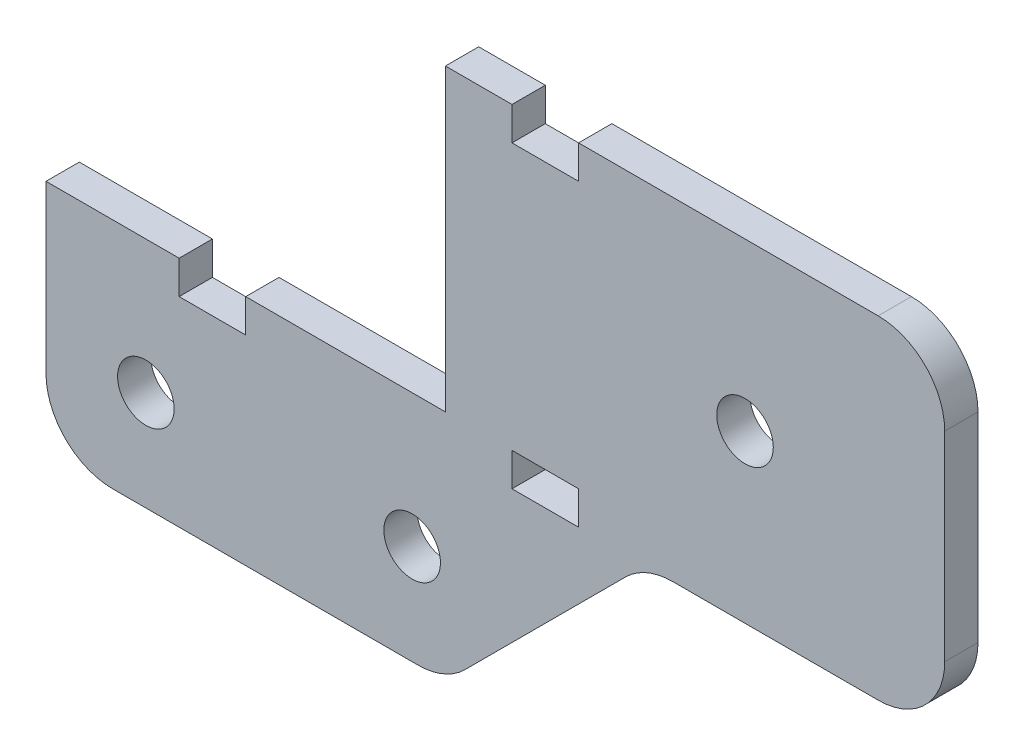
ISO-10303-21;
HEADER;
FILE_DESCRIPTION(('STEP AP214'),'2;1');
FILE_NAME('part.step','',(''),(''),'','','');
FILE_SCHEMA(('AUTOMOTIVE_DESIGN { 1 0 10303 214 1 1 1 1 }'));
ENDSEC;
DATA;
#1=APPLICATION_CONTEXT('core data for automotive mechanical design processes');
#2=APPLICATION_PROTOCOL_DEFINITION('international standard','automotive_design',2000,#1);
#3=PRODUCT_CONTEXT('',#1,'mechanical');
#4=PRODUCT('Part','Part','',(#3));
#5=PRODUCT_RELATED_PRODUCT_CATEGORY('part','',(#4));
#6=PRODUCT_DEFINITION_FORMATION('','',#4);
#7=PRODUCT_DEFINITION_CONTEXT('part definition',#1,'design');
#8=PRODUCT_DEFINITION('design','',#6,#7);
#9=PRODUCT_DEFINITION_SHAPE('','',#8);
#10=(LENGTH_UNIT() NAMED_UNIT(*) SI_UNIT(.MILLI.,.METRE.));
#11=(NAMED_UNIT(*) PLANE_ANGLE_UNIT() SI_UNIT($,.RADIAN.));
#12=(NAMED_UNIT(*) SI_UNIT($,.STERADIAN.) SOLID_ANGLE_UNIT());
#13=UNCERTAINTY_MEASURE_WITH_UNIT(LENGTH_MEASURE(1.E-05),#10,'distance_accuracy_value','');
#14=(GEOMETRIC_REPRESENTATION_CONTEXT(3) GLOBAL_UNCERTAINTY_ASSIGNED_CONTEXT((#13)) GLOBAL_UNIT_ASSIGNED_CONTEXT((#10,
#11,#12)) REPRESENTATION_CONTEXT('',''));
#15=CARTESIAN_POINT('',(0.,0.,0.));
#16=DIRECTION('',(0.,0.,1.));
#17=DIRECTION('',(1.,0.,0.));
#18=AXIS2_PLACEMENT_3D('',#15,#16,#17);
#19=CARTESIAN_POINT('',(-30.,0.,2.5));
#20=DIRECTION('',(1.,0.,0.));
#21=DIRECTION('',(0.,0.,-1.));
#22=AXIS2_PLACEMENT_3D('',#19,#20,#21);
#23=PLANE('',#22);
#24=DIRECTION('',(0.,-1.,0.));
#25=VECTOR('',#24,1.);
#26=CARTESIAN_POINT('',(-30.,0.,-2.5));
#27=LINE('',#26,#25);
#28=CARTESIAN_POINT('',(-30.,-20.,-2.5));
#29=VERTEX_POINT('',#28);
#30=CARTESIAN_POINT('',(-30.,-25.,-2.5));
#31=VERTEX_POINT('',#30);
#32=EDGE_CURVE('E369',#29,#31,#27,.T.);
#33=ORIENTED_EDGE('',*,*,#32,.T.);
#34=DIRECTION('',(0.,0.,-1.));
#35=VECTOR('',#34,1.);
#36=CARTESIAN_POINT('',(-30.,-25.,2.5));
#37=LINE('',#36,#35);
#38=CARTESIAN_POINT('',(-30.,-25.,2.5));
#39=VERTEX_POINT('',#38);
#40=EDGE_CURVE('E387',#39,#31,#37,.T.);
#41=ORIENTED_EDGE('',*,*,#40,.F.);
#42=DIRECTION('',(0.,-1.,0.));
#43=VECTOR('',#42,1.);
#44=CARTESIAN_POINT('',(-30.,0.,2.5));
#45=LINE('',#44,#43);
#46=CARTESIAN_POINT('',(-30.,-20.,2.5));
#47=VERTEX_POINT('',#46);
#48=EDGE_CURVE('E313',#47,#39,#45,.T.);
#49=ORIENTED_EDGE('',*,*,#48,.F.);
#50=DIRECTION('',(0.,0.,-1.));
#51=VECTOR('',#50,1.);
#52=CARTESIAN_POINT('',(-30.,-20.,2.5));
#53=LINE('',#52,#51);
#54=EDGE_CURVE('E224',#47,#29,#53,.T.);
#55=ORIENTED_EDGE('',*,*,#54,.T.);
#56=EDGE_LOOP('',(#33,#41,#49,#55));
#57=FACE_BOUND('',#56,.T.);
#58=ADVANCED_FACE('F44',(#57),#23,.F.);
#59=CARTESIAN_POINT('',(0.,-25.,2.5));
#60=DIRECTION('',(0.,1.,0.));
#61=DIRECTION('',(0.,0.,1.));
#62=AXIS2_PLACEMENT_3D('',#59,#60,#61);
#63=PLANE('',#62);
#64=DIRECTION('',(1.,0.,0.));
#65=VECTOR('',#64,1.);
#66=CARTESIAN_POINT('',(0.,-25.,-2.5));
#67=LINE('',#66,#65);
#68=CARTESIAN_POINT('',(-40.,-25.,-2.5));
#69=VERTEX_POINT('',#68);
#70=EDGE_CURVE('E372',#69,#31,#67,.T.);
#71=ORIENTED_EDGE('',*,*,#70,.F.);
#72=DIRECTION('',(0.,0.,-1.));
#73=VECTOR('',#72,1.);
#74=CARTESIAN_POINT('',(-40.,-25.,2.5));
#75=LINE('',#74,#73);
#76=CARTESIAN_POINT('',(-40.,-25.,2.5));
#77=VERTEX_POINT('',#76);
#78=EDGE_CURVE('E385',#77,#69,#75,.T.);
#79=ORIENTED_EDGE('',*,*,#78,.F.);
#80=DIRECTION('',(1.,0.,0.));
#81=VECTOR('',#80,1.);
#82=CARTESIAN_POINT('',(0.,-25.,2.5));
#83=LINE('',#82,#81);
#84=EDGE_CURVE('E315',#77,#39,#83,.T.);
#85=ORIENTED_EDGE('',*,*,#84,.T.);
#86=ORIENTED_EDGE('',*,*,#40,.T.);
#87=EDGE_LOOP('',(#71,#79,#85,#86));
#88=FACE_BOUND('',#87,.T.);
#89=ADVANCED_FACE('F523',(#88),#63,.T.);
#90=CARTESIAN_POINT('',(-40.,0.,2.5));
#91=DIRECTION('',(-1.,0.,0.));
#92=DIRECTION('',(0.,-1.,0.));
#93=AXIS2_PLACEMENT_3D('',#90,#91,#92);
#94=PLANE('',#93);
#95=DIRECTION('',(0.,1.,0.));
#96=VECTOR('',#95,1.);
#97=CARTESIAN_POINT('',(-40.,0.,-2.5));
#98=LINE('',#97,#96);
#99=CARTESIAN_POINT('',(-40.,-20.,-2.5));
#100=VERTEX_POINT('',#99);
#101=EDGE_CURVE('E375',#69,#100,#98,.T.);
#102=ORIENTED_EDGE('',*,*,#101,.T.);
#103=DIRECTION('',(0.,0.,-1.));
#104=VECTOR('',#103,1.);
#105=CARTESIAN_POINT('',(-40.,-20.,2.5));
#106=LINE('',#105,#104);
#107=CARTESIAN_POINT('',(-40.,-20.,2.5));
#108=VERTEX_POINT('',#107);
#109=EDGE_CURVE('E382',#108,#100,#106,.T.);
#110=ORIENTED_EDGE('',*,*,#109,.F.);
#111=DIRECTION('',(0.,1.,0.));
#112=VECTOR('',#111,1.);
#113=CARTESIAN_POINT('',(-40.,0.,2.5));
#114=LINE('',#113,#112);
#115=EDGE_CURVE('E321',#77,#108,#114,.T.);
#116=ORIENTED_EDGE('',*,*,#115,.F.);
#117=ORIENTED_EDGE('',*,*,#78,.T.);
#118=EDGE_LOOP('',(#102,#110,#116,#117));
#119=FACE_BOUND('',#118,.T.);
#120=ADVANCED_FACE('F529',(#119),#94,.F.);
#121=CARTESIAN_POINT('',(2.50000000000001,-2.50000000000001,2.5));
#122=DIRECTION('',(-0.707106781186547,0.707106781186548,0.));
#123=DIRECTION('',(-0.707106781186548,-0.707106781186547,0.));
#124=AXIS2_PLACEMENT_3D('',#121,#122,#123);
#125=PLANE('',#124);
#126=DIRECTION('',(0.707106781186548,0.707106781186547,0.));
#127=VECTOR('',#126,1.);
#128=CARTESIAN_POINT('',(2.50000000000001,-2.50000000000001,2.5));
#129=LINE('',#128,#127);
#130=CARTESIAN_POINT('',(-47.0710678118655,-52.0710678118655,2.5));
#131=VERTEX_POINT('',#130);
#132=CARTESIAN_POINT('',(-22.9289321881345,-27.9289321881345,2.5));
#133=VERTEX_POINT('',#132);
#134=EDGE_CURVE('E379',#131,#133,#129,.T.);
#135=ORIENTED_EDGE('',*,*,#134,.F.);
#136=DIRECTION('',(0.,0.,-1.));
#137=VECTOR('',#136,1.);
#138=CARTESIAN_POINT('',(-47.0710678118655,-52.0710678118655,2.5));
#139=LINE('',#138,#137);
#140=CARTESIAN_POINT('',(-47.0710678118655,-52.0710678118655,-2.5));
#141=VERTEX_POINT('',#140);
#142=EDGE_CURVE('E434',#131,#141,#139,.T.);
#143=ORIENTED_EDGE('',*,*,#142,.T.);
#144=DIRECTION('',(0.707106781186548,0.707106781186547,0.));
#145=VECTOR('',#144,1.);
#146=CARTESIAN_POINT('',(2.50000000000001,-2.50000000000001,-2.5));
#147=LINE('',#146,#145);
#148=CARTESIAN_POINT('',(-22.9289321881345,-27.9289321881345,-2.5));
#149=VERTEX_POINT('',#148);
#150=EDGE_CURVE('E327',#141,#149,#147,.T.);
#151=ORIENTED_EDGE('',*,*,#150,.T.);
#152=DIRECTION('',(0.,0.,-1.));
#153=VECTOR('',#152,1.);
#154=CARTESIAN_POINT('',(-22.9289321881345,-27.9289321881345,2.5));
#155=LINE('',#154,#153);
#156=EDGE_CURVE('E437',#149,#133,#155,.F.);
#157=ORIENTED_EDGE('',*,*,#156,.T.);
#158=EDGE_LOOP('',(#135,#143,#151,#157));
#159=FACE_BOUND('',#158,.T.);
#160=ADVANCED_FACE('F433',(#159),#125,.F.);
#161=CARTESIAN_POINT('',(0.,-25.,2.5));
#162=DIRECTION('',(0.,1.,0.));
#163=DIRECTION('',(-1.,0.,0.));
#164=AXIS2_PLACEMENT_3D('',#161,#162,#163);
#165=PLANE('',#164);
#166=DIRECTION('',(1.,0.,0.));
#167=VECTOR('',#166,1.);
#168=CARTESIAN_POINT('',(0.,-25.,-2.5));
#169=LINE('',#168,#167);
#170=CARTESIAN_POINT('',(-15.857864376269,-25.,-2.5));
#171=VERTEX_POINT('',#170);
#172=CARTESIAN_POINT('',(15.,-25.,-2.5));
#173=VERTEX_POINT('',#172);
#174=EDGE_CURVE('E330',#171,#173,#169,.T.);
#175=ORIENTED_EDGE('',*,*,#174,.T.);
#176=DIRECTION('',(0.,0.,-1.));
#177=VECTOR('',#176,1.);
#178=CARTESIAN_POINT('',(15.,-25.,2.5));
#179=LINE('',#178,#177);
#180=CARTESIAN_POINT('',(15.,-25.,2.5));
#181=VERTEX_POINT('',#180);
#182=EDGE_CURVE('E450',#173,#181,#179,.F.);
#183=ORIENTED_EDGE('',*,*,#182,.T.);
#184=DIRECTION('',(1.,0.,0.));
#185=VECTOR('',#184,1.);
#186=CARTESIAN_POINT('',(0.,-25.,2.5));
#187=LINE('',#186,#185);
#188=CARTESIAN_POINT('',(-15.857864376269,-25.,2.5));
#189=VERTEX_POINT('',#188);
#190=EDGE_CURVE('E438',#189,#181,#187,.T.);
#191=ORIENTED_EDGE('',*,*,#190,.F.);
#192=DIRECTION('',(0.,0.,-1.));
#193=VECTOR('',#192,1.);
#194=CARTESIAN_POINT('',(-15.857864376269,-25.,-2.5));
#195=LINE('',#194,#193);
#196=EDGE_CURVE('E451',#189,#171,#195,.T.);
#197=ORIENTED_EDGE('',*,*,#196,.T.);
#198=EDGE_LOOP('',(#175,#183,#191,#197));
#199=FACE_BOUND('',#198,.T.);
#200=ADVANCED_FACE('F457',(#199),#165,.F.);
#201=CARTESIAN_POINT('',(25.,0.,2.5));
#202=DIRECTION('',(1.,0.,0.));
#203=DIRECTION('',(0.,0.,-1.));
#204=AXIS2_PLACEMENT_3D('',#201,#202,#203);
#205=PLANE('',#204);
#206=DIRECTION('',(0.,-1.,0.));
#207=VECTOR('',#206,1.);
#208=CARTESIAN_POINT('',(25.,0.,-2.5));
#209=LINE('',#208,#207);
#210=CARTESIAN_POINT('',(25.,15.,-2.5));
#211=VERTEX_POINT('',#210);
#212=CARTESIAN_POINT('',(25.,-15.,-2.5));
#213=VERTEX_POINT('',#212);
#214=EDGE_CURVE('E334',#211,#213,#209,.T.);
#215=ORIENTED_EDGE('',*,*,#214,.F.);
#216=DIRECTION('',(0.,0.,-1.));
#217=VECTOR('',#216,1.);
#218=CARTESIAN_POINT('',(25.,15.,2.5));
#219=LINE('',#218,#217);
#220=CARTESIAN_POINT('',(25.,15.,2.5));
#221=VERTEX_POINT('',#220);
#222=EDGE_CURVE('E420',#211,#221,#219,.F.);
#223=ORIENTED_EDGE('',*,*,#222,.T.);
#224=DIRECTION('',(0.,-1.,0.));
#225=VECTOR('',#224,1.);
#226=CARTESIAN_POINT('',(25.,0.,2.5));
#227=LINE('',#226,#225);
#228=CARTESIAN_POINT('',(25.,-15.,2.5));
#229=VERTEX_POINT('',#228);
#230=EDGE_CURVE('E236',#221,#229,#227,.T.);
#231=ORIENTED_EDGE('',*,*,#230,.T.);
#232=DIRECTION('',(0.,0.,-1.));
#233=VECTOR('',#232,1.);
#234=CARTESIAN_POINT('',(25.,-15.,-2.5));
#235=LINE('',#234,#233);
#236=EDGE_CURVE('E418',#229,#213,#235,.T.);
#237=ORIENTED_EDGE('',*,*,#236,.T.);
#238=EDGE_LOOP('',(#215,#223,#231,#237));
#239=FACE_BOUND('',#238,.T.);
#240=ADVANCED_FACE('F468',(#239),#205,.T.);
#241=CARTESIAN_POINT('',(0.,25.,2.5));
#242=DIRECTION('',(0.,1.,0.));
#243=DIRECTION('',(-1.,0.,0.));
#244=AXIS2_PLACEMENT_3D('',#241,#242,#243);
#245=PLANE('',#244);
#246=DIRECTION('',(1.,0.,0.));
#247=VECTOR('',#246,1.);
#248=CARTESIAN_POINT('',(0.,25.,2.5));
#249=LINE('',#248,#247);
#250=CARTESIAN_POINT('',(-30.,25.,2.5));
#251=VERTEX_POINT('',#250);
#252=CARTESIAN_POINT('',(15.,25.,2.5));
#253=VERTEX_POINT('',#252);
#254=EDGE_CURVE('E216',#251,#253,#249,.T.);
#255=ORIENTED_EDGE('',*,*,#254,.T.);
#256=DIRECTION('',(0.,0.,-1.));
#257=VECTOR('',#256,1.);
#258=CARTESIAN_POINT('',(15.,25.,2.5));
#259=LINE('',#258,#257);
#260=CARTESIAN_POINT('',(15.,25.,-2.5));
#261=VERTEX_POINT('',#260);
#262=EDGE_CURVE('E389',#253,#261,#259,.T.);
#263=ORIENTED_EDGE('',*,*,#262,.T.);
#264=DIRECTION('',(1.,0.,0.));
#265=VECTOR('',#264,1.);
#266=CARTESIAN_POINT('',(0.,25.,-2.5));
#267=LINE('',#266,#265);
#268=CARTESIAN_POINT('',(-30.,25.,-2.5));
#269=VERTEX_POINT('',#268);
#270=EDGE_CURVE('E219',#269,#261,#267,.T.);
#271=ORIENTED_EDGE('',*,*,#270,.F.);
#272=DIRECTION('',(0.,0.,-1.));
#273=VECTOR('',#272,1.);
#274=CARTESIAN_POINT('',(-30.,25.,2.5));
#275=LINE('',#274,#273);
#276=EDGE_CURVE('E212',#251,#269,#275,.T.);
#277=ORIENTED_EDGE('',*,*,#276,.F.);
#278=EDGE_LOOP('',(#255,#263,#271,#277));
#279=FACE_BOUND('',#278,.T.);
#280=ADVANCED_FACE('F214',(#279),#245,.T.);
#281=CARTESIAN_POINT('',(-30.,0.,2.5));
#282=DIRECTION('',(-1.,0.,0.));
#283=DIRECTION('',(0.,0.,1.));
#284=AXIS2_PLACEMENT_3D('',#281,#282,#283);
#285=PLANE('',#284);
#286=DIRECTION('',(0.,1.,0.));
#287=VECTOR('',#286,1.);
#288=CARTESIAN_POINT('',(-30.,0.,-2.5));
#289=LINE('',#288,#287);
#290=CARTESIAN_POINT('',(-30.,20.,-2.5));
#291=VERTEX_POINT('',#290);
#292=EDGE_CURVE('E338',#291,#269,#289,.T.);
#293=ORIENTED_EDGE('',*,*,#292,.F.);
#294=DIRECTION('',(0.,0.,-1.));
#295=VECTOR('',#294,1.);
#296=CARTESIAN_POINT('',(-30.,20.,2.5));
#297=LINE('',#296,#295);
#298=CARTESIAN_POINT('',(-30.,20.,2.5));
#299=VERTEX_POINT('',#298);
#300=EDGE_CURVE('E225',#299,#291,#297,.T.);
#301=ORIENTED_EDGE('',*,*,#300,.F.);
#302=DIRECTION('',(0.,1.,0.));
#303=VECTOR('',#302,1.);
#304=CARTESIAN_POINT('',(-30.,0.,2.5));
#305=LINE('',#304,#303);
#306=EDGE_CURVE('E232',#299,#251,#305,.T.);
#307=ORIENTED_EDGE('',*,*,#306,.T.);
#308=ORIENTED_EDGE('',*,*,#276,.T.);
#309=EDGE_LOOP('',(#293,#301,#307,#308));
#310=FACE_BOUND('',#309,.T.);
#311=ADVANCED_FACE('F238',(#310),#285,.T.);
#312=CARTESIAN_POINT('',(0.,20.,2.5));
#313=DIRECTION('',(0.,1.,0.));
#314=DIRECTION('',(-1.,0.,0.));
#315=AXIS2_PLACEMENT_3D('',#312,#313,#314);
#316=PLANE('',#315);
#317=DIRECTION('',(1.,0.,0.));
#318=VECTOR('',#317,1.);
#319=CARTESIAN_POINT('',(0.,20.,-2.5));
#320=LINE('',#319,#318);
#321=CARTESIAN_POINT('',(-40.,20.,-2.5));
#322=VERTEX_POINT('',#321);
#323=EDGE_CURVE('E340',#322,#291,#320,.T.);
#324=ORIENTED_EDGE('',*,*,#323,.F.);
#325=DIRECTION('',(0.,0.,-1.));
#326=VECTOR('',#325,1.);
#327=CARTESIAN_POINT('',(-40.,20.,2.5));
#328=LINE('',#327,#326);
#329=CARTESIAN_POINT('',(-40.,20.,2.5));
#330=VERTEX_POINT('',#329);
#331=EDGE_CURVE('E406',#330,#322,#328,.T.);
#332=ORIENTED_EDGE('',*,*,#331,.F.);
#333=DIRECTION('',(1.,0.,0.));
#334=VECTOR('',#333,1.);
#335=CARTESIAN_POINT('',(0.,20.,2.5));
#336=LINE('',#335,#334);
#337=EDGE_CURVE('E239',#330,#299,#336,.T.);
#338=ORIENTED_EDGE('',*,*,#337,.T.);
#339=ORIENTED_EDGE('',*,*,#300,.T.);
#340=EDGE_LOOP('',(#324,#332,#338,#339));
#341=FACE_BOUND('',#340,.T.);
#342=ADVANCED_FACE('F569',(#341),#316,.T.);
#343=CARTESIAN_POINT('',(-40.,0.,2.5));
#344=DIRECTION('',(1.,0.,0.));
#345=DIRECTION('',(0.,1.,0.));
#346=AXIS2_PLACEMENT_3D('',#343,#344,#345);
#347=PLANE('',#346);
#348=DIRECTION('',(0.,-1.,0.));
#349=VECTOR('',#348,1.);
#350=CARTESIAN_POINT('',(-40.,0.,-2.5));
#351=LINE('',#350,#349);
#352=CARTESIAN_POINT('',(-40.,25.,-2.5));
#353=VERTEX_POINT('',#352);
#354=EDGE_CURVE('E343',#353,#322,#351,.T.);
#355=ORIENTED_EDGE('',*,*,#354,.F.);
#356=DIRECTION('',(0.,0.,-1.));
#357=VECTOR('',#356,1.);
#358=CARTESIAN_POINT('',(-40.,25.,2.5));
#359=LINE('',#358,#357);
#360=CARTESIAN_POINT('',(-40.,25.,2.5));
#361=VERTEX_POINT('',#360);
#362=EDGE_CURVE('E404',#361,#353,#359,.T.);
#363=ORIENTED_EDGE('',*,*,#362,.F.);
#364=DIRECTION('',(0.,-1.,0.));
#365=VECTOR('',#364,1.);
#366=CARTESIAN_POINT('',(-40.,0.,2.5));
#367=LINE('',#366,#365);
#368=EDGE_CURVE('E241',#361,#330,#367,.T.);
#369=ORIENTED_EDGE('',*,*,#368,.T.);
#370=ORIENTED_EDGE('',*,*,#331,.T.);
#371=EDGE_LOOP('',(#355,#363,#369,#370));
#372=FACE_BOUND('',#371,.T.);
#373=ADVANCED_FACE('F565',(#372),#347,.T.);
#374=CARTESIAN_POINT('',(0.,25.,2.5));
#375=DIRECTION('',(0.,1.,0.));
#376=DIRECTION('',(0.,0.,1.));
#377=AXIS2_PLACEMENT_3D('',#374,#375,#376);
#378=PLANE('',#377);
#379=DIRECTION('',(1.,0.,0.));
#380=VECTOR('',#379,1.);
#381=CARTESIAN_POINT('',(0.,25.,-2.5));
#382=LINE('',#381,#380);
#383=CARTESIAN_POINT('',(-50.,25.,-2.5));
#384=VERTEX_POINT('',#383);
#385=EDGE_CURVE('E346',#384,#353,#382,.T.);
#386=ORIENTED_EDGE('',*,*,#385,.F.);
#387=DIRECTION('',(0.,0.,-1.));
#388=VECTOR('',#387,1.);
#389=CARTESIAN_POINT('',(-50.,25.,2.5));
#390=LINE('',#389,#388);
#391=CARTESIAN_POINT('',(-50.,25.,2.5));
#392=VERTEX_POINT('',#391);
#393=EDGE_CURVE('E402',#392,#384,#390,.T.);
#394=ORIENTED_EDGE('',*,*,#393,.F.);
#395=DIRECTION('',(1.,0.,0.));
#396=VECTOR('',#395,1.);
#397=CARTESIAN_POINT('',(0.,25.,2.5));
#398=LINE('',#397,#396);
#399=EDGE_CURVE('E258',#392,#361,#398,.T.);
#400=ORIENTED_EDGE('',*,*,#399,.T.);
#401=ORIENTED_EDGE('',*,*,#362,.T.);
#402=EDGE_LOOP('',(#386,#394,#400,#401));
#403=FACE_BOUND('',#402,.T.);
#404=ADVANCED_FACE('F561',(#403),#378,.T.);
#405=CARTESIAN_POINT('',(-50.,0.,2.5));
#406=DIRECTION('',(-1.,0.,0.));
#407=DIRECTION('',(0.,0.,1.));
#408=AXIS2_PLACEMENT_3D('',#405,#406,#407);
#409=PLANE('',#408);
#410=DIRECTION('',(0.,1.,0.));
#411=VECTOR('',#410,1.);
#412=CARTESIAN_POINT('',(-50.,0.,-2.5));
#413=LINE('',#412,#411);
#414=CARTESIAN_POINT('',(-50.,-20.,-2.5));
#415=VERTEX_POINT('',#414);
#416=EDGE_CURVE('E349',#415,#384,#413,.T.);
#417=ORIENTED_EDGE('',*,*,#416,.F.);
#418=DIRECTION('',(0.,0.,-1.));
#419=VECTOR('',#418,1.);
#420=CARTESIAN_POINT('',(-50.,-20.,2.5));
#421=LINE('',#420,#419);
#422=CARTESIAN_POINT('',(-50.,-20.,2.5));
#423=VERTEX_POINT('',#422);
#424=EDGE_CURVE('E400',#423,#415,#421,.T.);
#425=ORIENTED_EDGE('',*,*,#424,.F.);
#426=DIRECTION('',(0.,1.,0.));
#427=VECTOR('',#426,1.);
#428=CARTESIAN_POINT('',(-50.,0.,2.5));
#429=LINE('',#428,#427);
#430=EDGE_CURVE('E262',#423,#392,#429,.T.);
#431=ORIENTED_EDGE('',*,*,#430,.T.);
#432=ORIENTED_EDGE('',*,*,#393,.T.);
#433=EDGE_LOOP('',(#417,#425,#431,#432));
#434=FACE_BOUND('',#433,.T.);
#435=ADVANCED_FACE('F558',(#434),#409,.T.);
#436=CARTESIAN_POINT('',(0.,-20.,2.5));
#437=DIRECTION('',(0.,1.,0.));
#438=DIRECTION('',(-1.,0.,0.));
#439=AXIS2_PLACEMENT_3D('',#436,#437,#438);
#440=PLANE('',#439);
#441=DIRECTION('',(1.,0.,0.));
#442=VECTOR('',#441,1.);
#443=CARTESIAN_POINT('',(0.,-20.,-2.5));
#444=LINE('',#443,#442);
#445=CARTESIAN_POINT('',(-80.,-20.,-2.5));
#446=VERTEX_POINT('',#445);
#447=EDGE_CURVE('E352',#446,#415,#444,.T.);
#448=ORIENTED_EDGE('',*,*,#447,.F.);
#449=DIRECTION('',(0.,0.,-1.));
#450=VECTOR('',#449,1.);
#451=CARTESIAN_POINT('',(-80.,-20.,2.5));
#452=LINE('',#451,#450);
#453=CARTESIAN_POINT('',(-80.,-20.,2.5));
#454=VERTEX_POINT('',#453);
#455=EDGE_CURVE('E398',#454,#446,#452,.T.);
#456=ORIENTED_EDGE('',*,*,#455,.F.);
#457=DIRECTION('',(1.,0.,0.));
#458=VECTOR('',#457,1.);
#459=CARTESIAN_POINT('',(0.,-20.,2.5));
#460=LINE('',#459,#458);
#461=EDGE_CURVE('E266',#454,#423,#460,.T.);
#462=ORIENTED_EDGE('',*,*,#461,.T.);
#463=ORIENTED_EDGE('',*,*,#424,.T.);
#464=EDGE_LOOP('',(#448,#456,#462,#463));
#465=FACE_BOUND('',#464,.T.);
#466=ADVANCED_FACE('F546',(#465),#440,.T.);
#467=CARTESIAN_POINT('',(-80.,0.,2.5));
#468=DIRECTION('',(1.,0.,0.));
#469=DIRECTION('',(0.,0.,-1.));
#470=AXIS2_PLACEMENT_3D('',#467,#468,#469);
#471=PLANE('',#470);
#472=DIRECTION('',(0.,-1.,0.));
#473=VECTOR('',#472,1.);
#474=CARTESIAN_POINT('',(-80.,0.,-2.5));
#475=LINE('',#474,#473);
#476=CARTESIAN_POINT('',(-80.,-25.,-2.5));
#477=VERTEX_POINT('',#476);
#478=EDGE_CURVE('E355',#446,#477,#475,.T.);
#479=ORIENTED_EDGE('',*,*,#478,.T.);
#480=DIRECTION('',(0.,0.,-1.));
#481=VECTOR('',#480,1.);
#482=CARTESIAN_POINT('',(-80.,-25.,2.5));
#483=LINE('',#482,#481);
#484=CARTESIAN_POINT('',(-80.,-25.,2.5));
#485=VERTEX_POINT('',#484);
#486=EDGE_CURVE('E396',#485,#477,#483,.T.);
#487=ORIENTED_EDGE('',*,*,#486,.F.);
#488=DIRECTION('',(0.,-1.,0.));
#489=VECTOR('',#488,1.);
#490=CARTESIAN_POINT('',(-80.,0.,2.5));
#491=LINE('',#490,#489);
#492=EDGE_CURVE('E274',#454,#485,#491,.T.);
#493=ORIENTED_EDGE('',*,*,#492,.F.);
#494=ORIENTED_EDGE('',*,*,#455,.T.);
#495=EDGE_LOOP('',(#479,#487,#493,#494));
#496=FACE_BOUND('',#495,.T.);
#497=ADVANCED_FACE('F553',(#496),#471,.F.);
#498=CARTESIAN_POINT('',(0.,-25.,2.5));
#499=DIRECTION('',(0.,1.,0.));
#500=DIRECTION('',(0.,0.,1.));
#501=AXIS2_PLACEMENT_3D('',#498,#499,#500);
#502=PLANE('',#501);
#503=DIRECTION('',(1.,0.,0.));
#504=VECTOR('',#503,1.);
#505=CARTESIAN_POINT('',(0.,-25.,-2.5));
#506=LINE('',#505,#504);
#507=CARTESIAN_POINT('',(-90.,-25.,-2.5));
#508=VERTEX_POINT('',#507);
#509=EDGE_CURVE('E359',#508,#477,#506,.T.);
#510=ORIENTED_EDGE('',*,*,#509,.F.);
#511=DIRECTION('',(0.,0.,-1.));
#512=VECTOR('',#511,1.);
#513=CARTESIAN_POINT('',(-90.,-25.,2.5));
#514=LINE('',#513,#512);
#515=CARTESIAN_POINT('',(-90.,-25.,2.5));
#516=VERTEX_POINT('',#515);
#517=EDGE_CURVE('E394',#516,#508,#514,.T.);
#518=ORIENTED_EDGE('',*,*,#517,.F.);
#519=DIRECTION('',(1.,0.,0.));
#520=VECTOR('',#519,1.);
#521=CARTESIAN_POINT('',(0.,-25.,2.5));
#522=LINE('',#521,#520);
#523=EDGE_CURVE('E276',#516,#485,#522,.T.);
#524=ORIENTED_EDGE('',*,*,#523,.T.);
#525=ORIENTED_EDGE('',*,*,#486,.T.);
#526=EDGE_LOOP('',(#510,#518,#524,#525));
#527=FACE_BOUND('',#526,.T.);
#528=ADVANCED_FACE('F549',(#527),#502,.T.);
#529=CARTESIAN_POINT('',(-90.,0.,2.5));
#530=DIRECTION('',(1.,0.,0.));
#531=DIRECTION('',(0.,0.,-1.));
#532=AXIS2_PLACEMENT_3D('',#529,#530,#531);
#533=PLANE('',#532);
#534=DIRECTION('',(0.,-1.,0.));
#535=VECTOR('',#534,1.);
#536=CARTESIAN_POINT('',(-90.,0.,-2.5));
#537=LINE('',#536,#535);
#538=CARTESIAN_POINT('',(-90.,-20.,-2.5));
#539=VERTEX_POINT('',#538);
#540=EDGE_CURVE('E362',#539,#508,#537,.T.);
#541=ORIENTED_EDGE('',*,*,#540,.F.);
#542=DIRECTION('',(0.,0.,-1.));
#543=VECTOR('',#542,1.);
#544=CARTESIAN_POINT('',(-90.,-20.,2.5));
#545=LINE('',#544,#543);
#546=CARTESIAN_POINT('',(-90.,-20.,2.5));
#547=VERTEX_POINT('',#546);
#548=EDGE_CURVE('E392',#547,#539,#545,.T.);
#549=ORIENTED_EDGE('',*,*,#548,.F.);
#550=DIRECTION('',(0.,-1.,0.));
#551=VECTOR('',#550,1.);
#552=CARTESIAN_POINT('',(-90.,0.,2.5));
#553=LINE('',#552,#551);
#554=EDGE_CURVE('E280',#547,#516,#553,.T.);
#555=ORIENTED_EDGE('',*,*,#554,.T.);
#556=ORIENTED_EDGE('',*,*,#517,.T.);
#557=EDGE_LOOP('',(#541,#549,#555,#556));
#558=FACE_BOUND('',#557,.T.);
#559=ADVANCED_FACE('F544',(#558),#533,.T.);
#560=CARTESIAN_POINT('',(-110.,-20.,-2.5));
#561=VERTEX_POINT('',#560);
#562=EDGE_CURVE('E356',#561,#539,#444,.T.);
#563=ORIENTED_EDGE('',*,*,#562,.F.);
#564=DIRECTION('',(0.,0.,-1.));
#565=VECTOR('',#564,1.);
#566=CARTESIAN_POINT('',(-110.,-20.,2.5));
#567=LINE('',#566,#565);
#568=CARTESIAN_POINT('',(-110.,-20.,2.5));
#569=VERTEX_POINT('',#568);
#570=EDGE_CURVE('E326',#569,#561,#567,.T.);
#571=ORIENTED_EDGE('',*,*,#570,.F.);
#572=EDGE_CURVE('E284',#569,#547,#460,.T.);
#573=ORIENTED_EDGE('',*,*,#572,.T.);
#574=ORIENTED_EDGE('',*,*,#548,.T.);
#575=EDGE_LOOP('',(#563,#571,#573,#574));
#576=FACE_BOUND('',#575,.T.);
#577=ADVANCED_FACE('F540',(#576),#440,.T.);
#578=CARTESIAN_POINT('',(-110.,0.,2.5));
#579=DIRECTION('',(-1.,0.,0.));
#580=DIRECTION('',(0.,0.,1.));
#581=AXIS2_PLACEMENT_3D('',#578,#579,#580);
#582=PLANE('',#581);
#583=DIRECTION('',(0.,1.,0.));
#584=VECTOR('',#583,1.);
#585=CARTESIAN_POINT('',(-110.,0.,-2.5));
#586=LINE('',#585,#584);
#587=CARTESIAN_POINT('',(-110.,-45.,-2.5));
#588=VERTEX_POINT('',#587);
#589=EDGE_CURVE('E365',#588,#561,#586,.T.);
#590=ORIENTED_EDGE('',*,*,#589,.F.);
#591=DIRECTION('',(0.,0.,-1.));
#592=VECTOR('',#591,1.);
#593=CARTESIAN_POINT('',(-110.,-45.,2.5));
#594=LINE('',#593,#592);
#595=CARTESIAN_POINT('',(-110.,-45.,2.5));
#596=VERTEX_POINT('',#595);
#597=EDGE_CURVE('E442',#588,#596,#594,.F.);
#598=ORIENTED_EDGE('',*,*,#597,.T.);
#599=DIRECTION('',(0.,1.,0.));
#600=VECTOR('',#599,1.);
#601=CARTESIAN_POINT('',(-110.,0.,2.5));
#602=LINE('',#601,#600);
#603=EDGE_CURVE('E285',#596,#569,#602,.T.);
#604=ORIENTED_EDGE('',*,*,#603,.T.);
#605=ORIENTED_EDGE('',*,*,#570,.T.);
#606=EDGE_LOOP('',(#590,#598,#604,#605));
#607=FACE_BOUND('',#606,.T.);
#608=ADVANCED_FACE('F537',(#607),#582,.T.);
#609=CARTESIAN_POINT('',(0.,-55.,2.5));
#610=DIRECTION('',(0.,1.,0.));
#611=DIRECTION('',(0.,0.,1.));
#612=AXIS2_PLACEMENT_3D('',#609,#610,#611);
#613=PLANE('',#612);
#614=DIRECTION('',(1.,0.,0.));
#615=VECTOR('',#614,1.);
#616=CARTESIAN_POINT('',(0.,-55.,2.5));
#617=LINE('',#616,#615);
#618=CARTESIAN_POINT('',(-100.,-55.,2.5));
#619=VERTEX_POINT('',#618);
#620=CARTESIAN_POINT('',(-54.142135623731,-55.,2.5));
#621=VERTEX_POINT('',#620);
#622=EDGE_CURVE('E316',#619,#621,#617,.T.);
#623=ORIENTED_EDGE('',*,*,#622,.F.);
#624=DIRECTION('',(0.,0.,-1.));
#625=VECTOR('',#624,1.);
#626=CARTESIAN_POINT('',(-100.,-55.,-2.5));
#627=LINE('',#626,#625);
#628=CARTESIAN_POINT('',(-100.,-55.,-2.5));
#629=VERTEX_POINT('',#628);
#630=EDGE_CURVE('E446',#619,#629,#627,.T.);
#631=ORIENTED_EDGE('',*,*,#630,.T.);
#632=DIRECTION('',(1.,0.,0.));
#633=VECTOR('',#632,1.);
#634=CARTESIAN_POINT('',(0.,-55.,-2.5));
#635=LINE('',#634,#633);
#636=CARTESIAN_POINT('',(-54.142135623731,-55.,-2.5));
#637=VERTEX_POINT('',#636);
#638=EDGE_CURVE('E367',#629,#637,#635,.T.);
#639=ORIENTED_EDGE('',*,*,#638,.T.);
#640=DIRECTION('',(0.,0.,-1.));
#641=VECTOR('',#640,1.);
#642=CARTESIAN_POINT('',(-54.142135623731,-55.,2.5));
#643=LINE('',#642,#641);
#644=EDGE_CURVE('E59',#637,#621,#643,.F.);
#645=ORIENTED_EDGE('',*,*,#644,.T.);
#646=EDGE_LOOP('',(#623,#631,#639,#645));
#647=FACE_BOUND('',#646,.T.);
#648=ADVANCED_FACE('F534',(#647),#613,.F.);
#649=CARTESIAN_POINT('',(0.,-20.,2.5));
#650=DIRECTION('',(0.,1.,0.));
#651=DIRECTION('',(-1.,0.,0.));
#652=AXIS2_PLACEMENT_3D('',#649,#650,#651);
#653=PLANE('',#652);
#654=DIRECTION('',(1.,0.,0.));
#655=VECTOR('',#654,1.);
#656=CARTESIAN_POINT('',(0.,-20.,-2.5));
#657=LINE('',#656,#655);
#658=EDGE_CURVE('E377',#100,#29,#657,.T.);
#659=ORIENTED_EDGE('',*,*,#658,.T.);
#660=ORIENTED_EDGE('',*,*,#54,.F.);
#661=DIRECTION('',(1.,0.,0.));
#662=VECTOR('',#661,1.);
#663=CARTESIAN_POINT('',(0.,-20.,2.5));
#664=LINE('',#663,#662);
#665=EDGE_CURVE('E323',#108,#47,#664,.T.);
#666=ORIENTED_EDGE('',*,*,#665,.F.);
#667=ORIENTED_EDGE('',*,*,#109,.T.);
#668=EDGE_LOOP('',(#659,#660,#666,#667));
#669=FACE_BOUND('',#668,.T.);
#670=ADVANCED_FACE('F507',(#669),#653,.F.);
#671=CARTESIAN_POINT('',(0.,0.,2.5));
#672=DIRECTION('',(0.,0.,1.));
#673=DIRECTION('',(1.,0.,0.));
#674=AXIS2_PLACEMENT_3D('',#671,#672,#673);
#675=PLANE('',#674);
#676=CARTESIAN_POINT('',(-95.,-40.,2.5));
#677=DIRECTION('',(0.,0.,1.));
#678=DIRECTION('',(1.,0.,0.));
#679=AXIS2_PLACEMENT_3D('',#676,#677,#678);
#680=CIRCLE('',#679,4.25000000000001);
#681=CARTESIAN_POINT('',(-90.75,-40.,2.5));
#682=VERTEX_POINT('',#681);
#683=EDGE_CURVE('E493',#682,#682,#680,.T.);
#684=ORIENTED_EDGE('',*,*,#683,.F.);
#685=EDGE_LOOP('',(#684));
#686=FACE_BOUND('',#685,.T.);
#687=CARTESIAN_POINT('',(-55.,-40.,2.5));
#688=DIRECTION('',(0.,0.,1.));
#689=DIRECTION('',(1.,0.,0.));
#690=AXIS2_PLACEMENT_3D('',#687,#688,#689);
#691=CIRCLE('',#690,4.25000000000001);
#692=CARTESIAN_POINT('',(-50.75,-40.,2.5));
#693=VERTEX_POINT('',#692);
#694=EDGE_CURVE('E485',#693,#693,#691,.T.);
#695=ORIENTED_EDGE('',*,*,#694,.F.);
#696=EDGE_LOOP('',(#695));
#697=FACE_BOUND('',#696,.T.);
#698=CARTESIAN_POINT('',(-5.,0.,2.5));
#699=DIRECTION('',(0.,0.,1.));
#700=DIRECTION('',(1.,0.,0.));
#701=AXIS2_PLACEMENT_3D('',#698,#699,#700);
#702=CIRCLE('',#701,4.25);
#703=CARTESIAN_POINT('',(-0.750000000000004,0.,2.5));
#704=VERTEX_POINT('',#703);
#705=EDGE_CURVE('E477',#704,#704,#702,.T.);
#706=ORIENTED_EDGE('',*,*,#705,.F.);
#707=EDGE_LOOP('',(#706));
#708=FACE_BOUND('',#707,.T.);
#709=ORIENTED_EDGE('',*,*,#230,.F.);
#710=CARTESIAN_POINT('',(15.,15.,2.5));
#711=DIRECTION('',(0.,0.,1.));
#712=DIRECTION('',(1.,0.,0.));
#713=AXIS2_PLACEMENT_3D('',#710,#711,#712);
#714=CIRCLE('',#713,10.);
#715=EDGE_CURVE('E235',#221,#253,#714,.T.);
#716=ORIENTED_EDGE('',*,*,#715,.T.);
#717=ORIENTED_EDGE('',*,*,#254,.F.);
#718=ORIENTED_EDGE('',*,*,#306,.F.);
#719=ORIENTED_EDGE('',*,*,#337,.F.);
#720=ORIENTED_EDGE('',*,*,#368,.F.);
#721=ORIENTED_EDGE('',*,*,#399,.F.);
#722=ORIENTED_EDGE('',*,*,#430,.F.);
#723=ORIENTED_EDGE('',*,*,#461,.F.);
#724=ORIENTED_EDGE('',*,*,#492,.T.);
#725=ORIENTED_EDGE('',*,*,#523,.F.);
#726=ORIENTED_EDGE('',*,*,#554,.F.);
#727=ORIENTED_EDGE('',*,*,#572,.F.);
#728=ORIENTED_EDGE('',*,*,#603,.F.);
#729=CARTESIAN_POINT('',(-100.,-45.,2.5));
#730=DIRECTION('',(0.,0.,1.));
#731=DIRECTION('',(1.,0.,0.));
#732=AXIS2_PLACEMENT_3D('',#729,#730,#731);
#733=CIRCLE('',#732,10.);
#734=EDGE_CURVE('E66',#596,#619,#733,.T.);
#735=ORIENTED_EDGE('',*,*,#734,.T.);
#736=ORIENTED_EDGE('',*,*,#622,.T.);
#737=CARTESIAN_POINT('',(-54.142135623731,-45.,2.5));
#738=DIRECTION('',(0.,0.,1.));
#739=DIRECTION('',(1.,0.,0.));
#740=AXIS2_PLACEMENT_3D('',#737,#738,#739);
#741=CIRCLE('',#740,10.);
#742=EDGE_CURVE('E298',#621,#131,#741,.T.);
#743=ORIENTED_EDGE('',*,*,#742,.T.);
#744=ORIENTED_EDGE('',*,*,#134,.T.);
#745=CARTESIAN_POINT('',(-15.857864376269,-35.,2.5));
#746=DIRECTION('',(0.,0.,1.));
#747=DIRECTION('',(1.,0.,0.));
#748=AXIS2_PLACEMENT_3D('',#745,#746,#747);
#749=CIRCLE('',#748,10.);
#750=EDGE_CURVE('E12',#133,#189,#749,.F.);
#751=ORIENTED_EDGE('',*,*,#750,.T.);
#752=ORIENTED_EDGE('',*,*,#190,.T.);
#753=CARTESIAN_POINT('',(15.,-15.,2.5));
#754=DIRECTION('',(0.,0.,1.));
#755=DIRECTION('',(1.,0.,0.));
#756=AXIS2_PLACEMENT_3D('',#753,#754,#755);
#757=CIRCLE('',#756,10.);
#758=EDGE_CURVE('E297',#181,#229,#757,.T.);
#759=ORIENTED_EDGE('',*,*,#758,.T.);
#760=EDGE_LOOP('',(#709,#716,#717,#718,#719,#720,#721,#722,#723,#724,#725,#726,#727,#728,#735,
#736,#743,#744,#751,#752,#759));
#761=FACE_BOUND('',#760,.T.);
#762=ORIENTED_EDGE('',*,*,#48,.T.);
#763=ORIENTED_EDGE('',*,*,#84,.F.);
#764=ORIENTED_EDGE('',*,*,#115,.T.);
#765=ORIENTED_EDGE('',*,*,#665,.T.);
#766=EDGE_LOOP('',(#762,#763,#764,#765));
#767=FACE_BOUND('',#766,.T.);
#768=ADVANCED_FACE('F229',(#686,#697,#708,#761,#767),#675,.T.);
#769=CARTESIAN_POINT('',(0.,0.,-2.5));
#770=DIRECTION('',(0.,0.,1.));
#771=DIRECTION('',(1.,0.,0.));
#772=AXIS2_PLACEMENT_3D('',#769,#770,#771);
#773=PLANE('',#772);
#774=CARTESIAN_POINT('',(-95.,-40.,-2.5));
#775=DIRECTION('',(0.,0.,1.));
#776=DIRECTION('',(1.,0.,0.));
#777=AXIS2_PLACEMENT_3D('',#774,#775,#776);
#778=CIRCLE('',#777,4.25000000000001);
#779=CARTESIAN_POINT('',(-90.75,-40.,-2.5));
#780=VERTEX_POINT('',#779);
#781=EDGE_CURVE('E331',#780,#780,#778,.F.);
#782=ORIENTED_EDGE('',*,*,#781,.F.);
#783=EDGE_LOOP('',(#782));
#784=FACE_BOUND('',#783,.T.);
#785=CARTESIAN_POINT('',(-55.,-40.,-2.5));
#786=DIRECTION('',(0.,0.,1.));
#787=DIRECTION('',(1.,0.,0.));
#788=AXIS2_PLACEMENT_3D('',#785,#786,#787);
#789=CIRCLE('',#788,4.25000000000001);
#790=CARTESIAN_POINT('',(-50.75,-40.,-2.5));
#791=VERTEX_POINT('',#790);
#792=EDGE_CURVE('E483',#791,#791,#789,.F.);
#793=ORIENTED_EDGE('',*,*,#792,.F.);
#794=EDGE_LOOP('',(#793));
#795=FACE_BOUND('',#794,.T.);
#796=CARTESIAN_POINT('',(-5.,0.,-2.5));
#797=DIRECTION('',(0.,0.,1.));
#798=DIRECTION('',(1.,0.,0.));
#799=AXIS2_PLACEMENT_3D('',#796,#797,#798);
#800=CIRCLE('',#799,4.25);
#801=CARTESIAN_POINT('',(-0.750000000000004,0.,-2.5));
#802=VERTEX_POINT('',#801);
#803=EDGE_CURVE('E482',#802,#802,#800,.F.);
#804=ORIENTED_EDGE('',*,*,#803,.F.);
#805=EDGE_LOOP('',(#804));
#806=FACE_BOUND('',#805,.T.);
#807=ORIENTED_EDGE('',*,*,#270,.T.);
#808=CARTESIAN_POINT('',(15.,15.,-2.5));
#809=DIRECTION('',(0.,0.,1.));
#810=DIRECTION('',(1.,0.,0.));
#811=AXIS2_PLACEMENT_3D('',#808,#809,#810);
#812=CIRCLE('',#811,10.);
#813=EDGE_CURVE('E416',#261,#211,#812,.F.);
#814=ORIENTED_EDGE('',*,*,#813,.T.);
#815=ORIENTED_EDGE('',*,*,#214,.T.);
#816=CARTESIAN_POINT('',(15.,-15.,-2.5));
#817=DIRECTION('',(0.,0.,1.));
#818=DIRECTION('',(1.,0.,0.));
#819=AXIS2_PLACEMENT_3D('',#816,#817,#818);
#820=CIRCLE('',#819,10.);
#821=EDGE_CURVE('E414',#213,#173,#820,.F.);
#822=ORIENTED_EDGE('',*,*,#821,.T.);
#823=ORIENTED_EDGE('',*,*,#174,.F.);
#824=CARTESIAN_POINT('',(-15.857864376269,-35.,-2.5));
#825=DIRECTION('',(0.,0.,1.));
#826=DIRECTION('',(1.,0.,0.));
#827=AXIS2_PLACEMENT_3D('',#824,#825,#826);
#828=CIRCLE('',#827,10.);
#829=EDGE_CURVE('E52',#171,#149,#828,.T.);
#830=ORIENTED_EDGE('',*,*,#829,.T.);
#831=ORIENTED_EDGE('',*,*,#150,.F.);
#832=CARTESIAN_POINT('',(-54.142135623731,-45.,-2.5));
#833=DIRECTION('',(0.,0.,1.));
#834=DIRECTION('',(1.,0.,0.));
#835=AXIS2_PLACEMENT_3D('',#832,#833,#834);
#836=CIRCLE('',#835,10.);
#837=EDGE_CURVE('E410',#141,#637,#836,.F.);
#838=ORIENTED_EDGE('',*,*,#837,.T.);
#839=ORIENTED_EDGE('',*,*,#638,.F.);
#840=CARTESIAN_POINT('',(-100.,-45.,-2.5));
#841=DIRECTION('',(0.,0.,1.));
#842=DIRECTION('',(1.,0.,0.));
#843=AXIS2_PLACEMENT_3D('',#840,#841,#842);
#844=CIRCLE('',#843,10.);
#845=EDGE_CURVE('E412',#629,#588,#844,.F.);
#846=ORIENTED_EDGE('',*,*,#845,.T.);
#847=ORIENTED_EDGE('',*,*,#589,.T.);
#848=ORIENTED_EDGE('',*,*,#562,.T.);
#849=ORIENTED_EDGE('',*,*,#540,.T.);
#850=ORIENTED_EDGE('',*,*,#509,.T.);
#851=ORIENTED_EDGE('',*,*,#478,.F.);
#852=ORIENTED_EDGE('',*,*,#447,.T.);
#853=ORIENTED_EDGE('',*,*,#416,.T.);
#854=ORIENTED_EDGE('',*,*,#385,.T.);
#855=ORIENTED_EDGE('',*,*,#354,.T.);
#856=ORIENTED_EDGE('',*,*,#323,.T.);
#857=ORIENTED_EDGE('',*,*,#292,.T.);
#858=EDGE_LOOP('',(#807,#814,#815,#822,#823,#830,#831,#838,#839,#846,#847,#848,#849,#850,#851,
#852,#853,#854,#855,#856,#857));
#859=FACE_BOUND('',#858,.T.);
#860=ORIENTED_EDGE('',*,*,#32,.F.);
#861=ORIENTED_EDGE('',*,*,#658,.F.);
#862=ORIENTED_EDGE('',*,*,#101,.F.);
#863=ORIENTED_EDGE('',*,*,#70,.T.);
#864=EDGE_LOOP('',(#860,#861,#862,#863));
#865=FACE_BOUND('',#864,.T.);
#866=ADVANCED_FACE('F462',(#784,#795,#806,#859,#865),#773,.F.);
#867=CARTESIAN_POINT('',(15.,15.,2.5));
#868=DIRECTION('',(0.,0.,-1.));
#869=DIRECTION('',(-1.,0.,0.));
#870=AXIS2_PLACEMENT_3D('',#867,#868,#869);
#871=CYLINDRICAL_SURFACE('',#870,10.);
#872=ORIENTED_EDGE('',*,*,#715,.F.);
#873=ORIENTED_EDGE('',*,*,#222,.F.);
#874=ORIENTED_EDGE('',*,*,#813,.F.);
#875=ORIENTED_EDGE('',*,*,#262,.F.);
#876=EDGE_LOOP('',(#872,#873,#874,#875));
#877=FACE_BOUND('',#876,.T.);
#878=ADVANCED_FACE('F584',(#877),#871,.T.);
#879=CARTESIAN_POINT('',(15.,-15.,2.5));
#880=DIRECTION('',(0.,0.,1.));
#881=DIRECTION('',(1.,0.,0.));
#882=AXIS2_PLACEMENT_3D('',#879,#880,#881);
#883=CYLINDRICAL_SURFACE('',#882,10.);
#884=ORIENTED_EDGE('',*,*,#758,.F.);
#885=ORIENTED_EDGE('',*,*,#182,.F.);
#886=ORIENTED_EDGE('',*,*,#821,.F.);
#887=ORIENTED_EDGE('',*,*,#236,.F.);
#888=EDGE_LOOP('',(#884,#885,#886,#887));
#889=FACE_BOUND('',#888,.T.);
#890=ADVANCED_FACE('F467',(#889),#883,.T.);
#891=CARTESIAN_POINT('',(-100.,-45.,2.5));
#892=DIRECTION('',(0.,0.,1.));
#893=DIRECTION('',(1.,0.,0.));
#894=AXIS2_PLACEMENT_3D('',#891,#892,#893);
#895=CYLINDRICAL_SURFACE('',#894,10.);
#896=ORIENTED_EDGE('',*,*,#734,.F.);
#897=ORIENTED_EDGE('',*,*,#597,.F.);
#898=ORIENTED_EDGE('',*,*,#845,.F.);
#899=ORIENTED_EDGE('',*,*,#630,.F.);
#900=EDGE_LOOP('',(#896,#897,#898,#899));
#901=FACE_BOUND('',#900,.T.);
#902=ADVANCED_FACE('F590',(#901),#895,.T.);
#903=CARTESIAN_POINT('',(-54.142135623731,-45.,2.5));
#904=DIRECTION('',(0.,0.,-1.));
#905=DIRECTION('',(-1.,0.,0.));
#906=AXIS2_PLACEMENT_3D('',#903,#904,#905);
#907=CYLINDRICAL_SURFACE('',#906,10.);
#908=ORIENTED_EDGE('',*,*,#742,.F.);
#909=ORIENTED_EDGE('',*,*,#644,.F.);
#910=ORIENTED_EDGE('',*,*,#837,.F.);
#911=ORIENTED_EDGE('',*,*,#142,.F.);
#912=EDGE_LOOP('',(#908,#909,#910,#911));
#913=FACE_BOUND('',#912,.T.);
#914=ADVANCED_FACE('F440',(#913),#907,.T.);
#915=CARTESIAN_POINT('',(-15.857864376269,-35.,2.5));
#916=DIRECTION('',(0.,0.,1.));
#917=DIRECTION('',(1.,0.,0.));
#918=AXIS2_PLACEMENT_3D('',#915,#916,#917);
#919=CYLINDRICAL_SURFACE('',#918,10.);
#920=ORIENTED_EDGE('',*,*,#750,.F.);
#921=ORIENTED_EDGE('',*,*,#156,.F.);
#922=ORIENTED_EDGE('',*,*,#829,.F.);
#923=ORIENTED_EDGE('',*,*,#196,.F.);
#924=EDGE_LOOP('',(#920,#921,#922,#923));
#925=FACE_BOUND('',#924,.T.);
#926=ADVANCED_FACE('F46',(#925),#919,.F.);
#927=CARTESIAN_POINT('',(-5.,0.,-2.501));
#928=DIRECTION('',(0.,0.,1.));
#929=DIRECTION('',(1.,0.,0.));
#930=AXIS2_PLACEMENT_3D('',#927,#928,#929);
#931=CYLINDRICAL_SURFACE('',#930,4.25);
#932=ORIENTED_EDGE('',*,*,#705,.T.);
#933=EDGE_LOOP('',(#932));
#934=FACE_BOUND('',#933,.T.);
#935=ORIENTED_EDGE('',*,*,#803,.T.);
#936=EDGE_LOOP('',(#935));
#937=FACE_BOUND('',#936,.T.);
#938=ADVANCED_FACE('F512',(#934,#937),#931,.F.);
#939=CARTESIAN_POINT('',(-55.,-40.,-2.501));
#940=DIRECTION('',(0.,0.,1.));
#941=DIRECTION('',(1.,0.,0.));
#942=AXIS2_PLACEMENT_3D('',#939,#940,#941);
#943=CYLINDRICAL_SURFACE('',#942,4.25000000000001);
#944=ORIENTED_EDGE('',*,*,#694,.T.);
#945=EDGE_LOOP('',(#944));
#946=FACE_BOUND('',#945,.T.);
#947=ORIENTED_EDGE('',*,*,#792,.T.);
#948=EDGE_LOOP('',(#947));
#949=FACE_BOUND('',#948,.T.);
#950=ADVANCED_FACE('F514',(#946,#949),#943,.F.);
#951=CARTESIAN_POINT('',(-95.,-40.,-2.501));
#952=DIRECTION('',(0.,0.,1.));
#953=DIRECTION('',(1.,0.,0.));
#954=AXIS2_PLACEMENT_3D('',#951,#952,#953);
#955=CYLINDRICAL_SURFACE('',#954,4.25000000000001);
#956=ORIENTED_EDGE('',*,*,#683,.T.);
#957=EDGE_LOOP('',(#956));
#958=FACE_BOUND('',#957,.T.);
#959=ORIENTED_EDGE('',*,*,#781,.T.);
#960=EDGE_LOOP('',(#959));
#961=FACE_BOUND('',#960,.T.);
#962=ADVANCED_FACE('F502',(#958,#961),#955,.F.);
#963=CLOSED_SHELL('',(#58,#89,#120,#160,#200,#240,#280,#311,#342,#373,#404,#435,#466,#497,#528,
#559,#577,#608,#648,#670,#768,#866,#878,#890,#902,#914,#926,#938,#950,#962));
#964=MANIFOLD_SOLID_BREP('B2',#963);
#965=ADVANCED_BREP_SHAPE_REPRESENTATION('',(#18,#964),#14);
#966=SHAPE_DEFINITION_REPRESENTATION(#9,#965);
ENDSEC;
END-ISO-10303-21;
